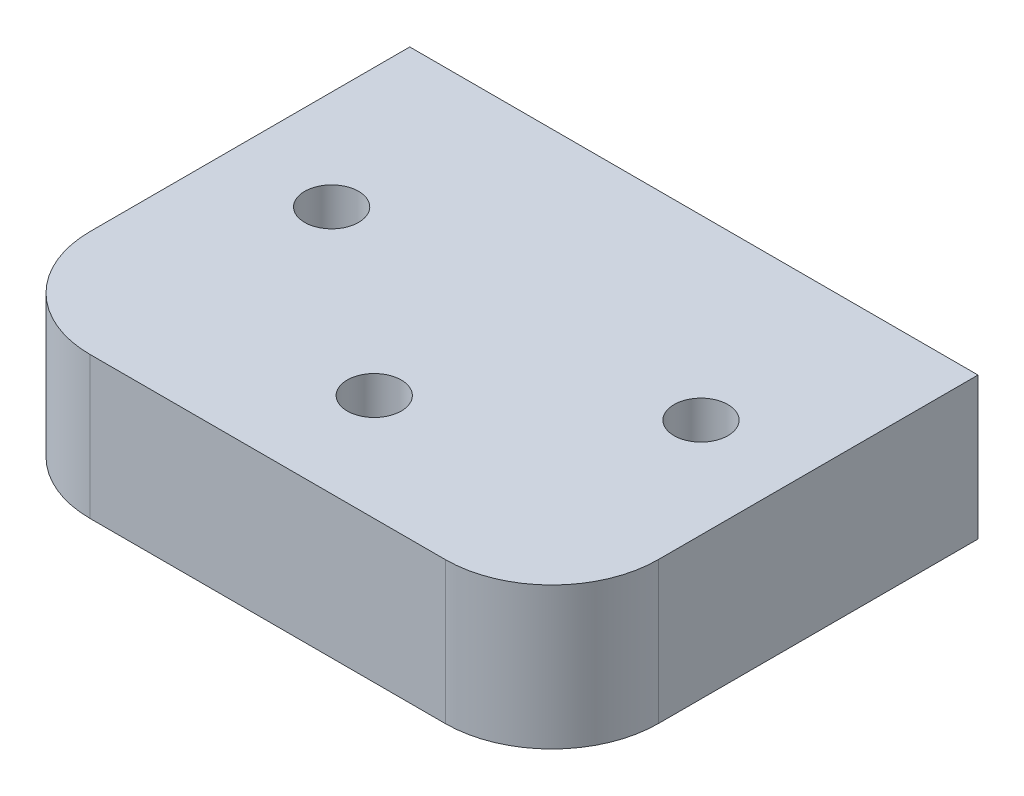
ISO-10303-21;
HEADER;
FILE_DESCRIPTION(('STEP AP214'),'2;1');
FILE_NAME('part.step','',(''),(''),'','','');
FILE_SCHEMA(('AUTOMOTIVE_DESIGN { 1 0 10303 214 1 1 1 1 }'));
ENDSEC;
DATA;
#1=APPLICATION_CONTEXT('core data for automotive mechanical design processes');
#2=APPLICATION_PROTOCOL_DEFINITION('international standard','automotive_design',2000,#1);
#3=PRODUCT_CONTEXT('',#1,'mechanical');
#4=PRODUCT('Part','Part','',(#3));
#5=PRODUCT_RELATED_PRODUCT_CATEGORY('part','',(#4));
#6=PRODUCT_DEFINITION_FORMATION('','',#4);
#7=PRODUCT_DEFINITION_CONTEXT('part definition',#1,'design');
#8=PRODUCT_DEFINITION('design','',#6,#7);
#9=PRODUCT_DEFINITION_SHAPE('','',#8);
#10=(LENGTH_UNIT() NAMED_UNIT(*) SI_UNIT(.MILLI.,.METRE.));
#11=(NAMED_UNIT(*) PLANE_ANGLE_UNIT() SI_UNIT($,.RADIAN.));
#12=(NAMED_UNIT(*) SI_UNIT($,.STERADIAN.) SOLID_ANGLE_UNIT());
#13=UNCERTAINTY_MEASURE_WITH_UNIT(LENGTH_MEASURE(1.E-05),#10,'distance_accuracy_value','');
#14=(GEOMETRIC_REPRESENTATION_CONTEXT(3) GLOBAL_UNCERTAINTY_ASSIGNED_CONTEXT((#13)) GLOBAL_UNIT_ASSIGNED_CONTEXT((#10,
#11,#12)) REPRESENTATION_CONTEXT('',''));
#15=CARTESIAN_POINT('',(0.,0.,0.));
#16=DIRECTION('',(0.,0.,1.));
#17=DIRECTION('',(1.,0.,0.));
#18=AXIS2_PLACEMENT_3D('',#15,#16,#17);
#19=CARTESIAN_POINT('',(0.,10.,0.));
#20=DIRECTION('',(1.,0.,0.));
#21=DIRECTION('',(0.,0.,-1.));
#22=AXIS2_PLACEMENT_3D('',#19,#20,#21);
#23=PLANE('',#22);
#24=DIRECTION('',(0.,0.,1.));
#25=VECTOR('',#24,1.);
#26=CARTESIAN_POINT('',(0.,0.,0.));
#27=LINE('',#26,#25);
#28=CARTESIAN_POINT('',(0.,0.,0.));
#29=VERTEX_POINT('',#28);
#30=CARTESIAN_POINT('',(0.,0.,22.5));
#31=VERTEX_POINT('',#30);
#32=EDGE_CURVE('E131',#29,#31,#27,.T.);
#33=ORIENTED_EDGE('',*,*,#32,.T.);
#34=DIRECTION('',(0.,-1.,0.));
#35=VECTOR('',#34,1.);
#36=CARTESIAN_POINT('',(0.,10.,22.5));
#37=LINE('',#36,#35);
#38=CARTESIAN_POINT('',(0.,10.,22.5));
#39=VERTEX_POINT('',#38);
#40=EDGE_CURVE('E11',#39,#31,#37,.T.);
#41=ORIENTED_EDGE('',*,*,#40,.F.);
#42=DIRECTION('',(0.,0.,1.));
#43=VECTOR('',#42,1.);
#44=CARTESIAN_POINT('',(0.,10.,0.));
#45=LINE('',#44,#43);
#46=CARTESIAN_POINT('',(0.,10.,0.));
#47=VERTEX_POINT('',#46);
#48=EDGE_CURVE('E148',#47,#39,#45,.T.);
#49=ORIENTED_EDGE('',*,*,#48,.F.);
#50=DIRECTION('',(0.,-1.,0.));
#51=VECTOR('',#50,1.);
#52=CARTESIAN_POINT('',(0.,10.,0.));
#53=LINE('',#52,#51);
#54=EDGE_CURVE('E127',#47,#29,#53,.T.);
#55=ORIENTED_EDGE('',*,*,#54,.T.);
#56=EDGE_LOOP('',(#33,#41,#49,#55));
#57=FACE_BOUND('',#56,.T.);
#58=ADVANCED_FACE('F39',(#57),#23,.F.);
#59=CARTESIAN_POINT('',(7.5,10.,22.5));
#60=DIRECTION('',(0.,-1.,0.));
#61=DIRECTION('',(0.,0.,-1.));
#62=AXIS2_PLACEMENT_3D('',#59,#60,#61);
#63=CYLINDRICAL_SURFACE('',#62,7.5);
#64=CARTESIAN_POINT('',(7.5,0.,22.5));
#65=DIRECTION('',(0.,1.,0.));
#66=DIRECTION('',(0.,0.,1.));
#67=AXIS2_PLACEMENT_3D('',#64,#65,#66);
#68=CIRCLE('',#67,7.5);
#69=CARTESIAN_POINT('',(7.5,0.,30.));
#70=VERTEX_POINT('',#69);
#71=EDGE_CURVE('E135',#31,#70,#68,.T.);
#72=ORIENTED_EDGE('',*,*,#71,.T.);
#73=DIRECTION('',(0.,-1.,0.));
#74=VECTOR('',#73,1.);
#75=CARTESIAN_POINT('',(7.5,10.,30.));
#76=LINE('',#75,#74);
#77=CARTESIAN_POINT('',(7.5,10.,30.));
#78=VERTEX_POINT('',#77);
#79=EDGE_CURVE('E48',#78,#70,#76,.T.);
#80=ORIENTED_EDGE('',*,*,#79,.F.);
#81=CARTESIAN_POINT('',(7.5,10.,22.5));
#82=DIRECTION('',(0.,1.,0.));
#83=DIRECTION('',(0.,0.,1.));
#84=AXIS2_PLACEMENT_3D('',#81,#82,#83);
#85=CIRCLE('',#84,7.5);
#86=EDGE_CURVE('E94',#39,#78,#85,.T.);
#87=ORIENTED_EDGE('',*,*,#86,.F.);
#88=ORIENTED_EDGE('',*,*,#40,.T.);
#89=EDGE_LOOP('',(#72,#80,#87,#88));
#90=FACE_BOUND('',#89,.T.);
#91=ADVANCED_FACE('F180',(#90),#63,.T.);
#92=CARTESIAN_POINT('',(7.5,10.,30.));
#93=DIRECTION('',(0.,0.,-1.));
#94=DIRECTION('',(-1.,0.,0.));
#95=AXIS2_PLACEMENT_3D('',#92,#93,#94);
#96=PLANE('',#95);
#97=DIRECTION('',(1.,0.,0.));
#98=VECTOR('',#97,1.);
#99=CARTESIAN_POINT('',(7.5,0.,30.));
#100=LINE('',#99,#98);
#101=CARTESIAN_POINT('',(32.5,0.,30.));
#102=VERTEX_POINT('',#101);
#103=EDGE_CURVE('E139',#70,#102,#100,.T.);
#104=ORIENTED_EDGE('',*,*,#103,.T.);
#105=DIRECTION('',(0.,-1.,0.));
#106=VECTOR('',#105,1.);
#107=CARTESIAN_POINT('',(32.5,10.,30.));
#108=LINE('',#107,#106);
#109=CARTESIAN_POINT('',(32.5,10.,30.));
#110=VERTEX_POINT('',#109);
#111=EDGE_CURVE('E120',#110,#102,#108,.T.);
#112=ORIENTED_EDGE('',*,*,#111,.F.);
#113=DIRECTION('',(1.,0.,0.));
#114=VECTOR('',#113,1.);
#115=CARTESIAN_POINT('',(7.5,10.,30.));
#116=LINE('',#115,#114);
#117=EDGE_CURVE('E109',#78,#110,#116,.T.);
#118=ORIENTED_EDGE('',*,*,#117,.F.);
#119=ORIENTED_EDGE('',*,*,#79,.T.);
#120=EDGE_LOOP('',(#104,#112,#118,#119));
#121=FACE_BOUND('',#120,.T.);
#122=ADVANCED_FACE('F158',(#121),#96,.F.);
#123=CARTESIAN_POINT('',(32.5,10.,22.5));
#124=DIRECTION('',(0.,-1.,0.));
#125=DIRECTION('',(0.,0.,-1.));
#126=AXIS2_PLACEMENT_3D('',#123,#124,#125);
#127=CYLINDRICAL_SURFACE('',#126,7.5);
#128=CARTESIAN_POINT('',(32.5,0.,22.5));
#129=DIRECTION('',(0.,1.,0.));
#130=DIRECTION('',(0.,0.,1.));
#131=AXIS2_PLACEMENT_3D('',#128,#129,#130);
#132=CIRCLE('',#131,7.5);
#133=CARTESIAN_POINT('',(40.,0.,22.5));
#134=VERTEX_POINT('',#133);
#135=EDGE_CURVE('E118',#102,#134,#132,.T.);
#136=ORIENTED_EDGE('',*,*,#135,.T.);
#137=DIRECTION('',(0.,-1.,0.));
#138=VECTOR('',#137,1.);
#139=CARTESIAN_POINT('',(40.,10.,22.5));
#140=LINE('',#139,#138);
#141=CARTESIAN_POINT('',(40.,10.,22.5));
#142=VERTEX_POINT('',#141);
#143=EDGE_CURVE('E115',#142,#134,#140,.T.);
#144=ORIENTED_EDGE('',*,*,#143,.F.);
#145=CARTESIAN_POINT('',(32.5,10.,22.5));
#146=DIRECTION('',(0.,1.,0.));
#147=DIRECTION('',(0.,0.,1.));
#148=AXIS2_PLACEMENT_3D('',#145,#146,#147);
#149=CIRCLE('',#148,7.5);
#150=EDGE_CURVE('E103',#110,#142,#149,.T.);
#151=ORIENTED_EDGE('',*,*,#150,.F.);
#152=ORIENTED_EDGE('',*,*,#111,.T.);
#153=EDGE_LOOP('',(#136,#144,#151,#152));
#154=FACE_BOUND('',#153,.T.);
#155=ADVANCED_FACE('F116',(#154),#127,.T.);
#156=CARTESIAN_POINT('',(40.,10.,0.));
#157=DIRECTION('',(-1.,0.,0.));
#158=DIRECTION('',(0.,0.,1.));
#159=AXIS2_PLACEMENT_3D('',#156,#157,#158);
#160=PLANE('',#159);
#161=DIRECTION('',(0.,0.,-1.));
#162=VECTOR('',#161,1.);
#163=CARTESIAN_POINT('',(40.,0.,0.));
#164=LINE('',#163,#162);
#165=CARTESIAN_POINT('',(40.,0.,0.));
#166=VERTEX_POINT('',#165);
#167=EDGE_CURVE('E80',#134,#166,#164,.T.);
#168=ORIENTED_EDGE('',*,*,#167,.T.);
#169=DIRECTION('',(0.,-1.,0.));
#170=VECTOR('',#169,1.);
#171=CARTESIAN_POINT('',(40.,10.,0.));
#172=LINE('',#171,#170);
#173=CARTESIAN_POINT('',(40.,10.,0.));
#174=VERTEX_POINT('',#173);
#175=EDGE_CURVE('E121',#174,#166,#172,.T.);
#176=ORIENTED_EDGE('',*,*,#175,.F.);
#177=DIRECTION('',(0.,0.,-1.));
#178=VECTOR('',#177,1.);
#179=CARTESIAN_POINT('',(40.,10.,0.));
#180=LINE('',#179,#178);
#181=EDGE_CURVE('E107',#142,#174,#180,.T.);
#182=ORIENTED_EDGE('',*,*,#181,.F.);
#183=ORIENTED_EDGE('',*,*,#143,.T.);
#184=EDGE_LOOP('',(#168,#176,#182,#183));
#185=FACE_BOUND('',#184,.T.);
#186=ADVANCED_FACE('F123',(#185),#160,.F.);
#187=CARTESIAN_POINT('',(0.,10.,0.));
#188=DIRECTION('',(0.,0.,1.));
#189=DIRECTION('',(1.,0.,0.));
#190=AXIS2_PLACEMENT_3D('',#187,#188,#189);
#191=PLANE('',#190);
#192=CARTESIAN_POINT('',(32.5,5.,0.));
#193=DIRECTION('',(0.,0.,-1.));
#194=DIRECTION('',(-1.,0.,0.));
#195=AXIS2_PLACEMENT_3D('',#192,#193,#194);
#196=CIRCLE('',#195,1.35255);
#197=CARTESIAN_POINT('',(31.14745,5.,0.));
#198=VERTEX_POINT('',#197);
#199=EDGE_CURVE('E315',#198,#198,#196,.T.);
#200=ORIENTED_EDGE('',*,*,#199,.F.);
#201=EDGE_LOOP('',(#200));
#202=FACE_BOUND('',#201,.T.);
#203=CARTESIAN_POINT('',(20.,5.,0.));
#204=DIRECTION('',(0.,0.,-1.));
#205=DIRECTION('',(-1.,0.,0.));
#206=AXIS2_PLACEMENT_3D('',#203,#204,#205);
#207=CIRCLE('',#206,1.35255);
#208=CARTESIAN_POINT('',(18.64745,5.,0.));
#209=VERTEX_POINT('',#208);
#210=EDGE_CURVE('E319',#209,#209,#207,.T.);
#211=ORIENTED_EDGE('',*,*,#210,.F.);
#212=EDGE_LOOP('',(#211));
#213=FACE_BOUND('',#212,.T.);
#214=CARTESIAN_POINT('',(7.5,5.,0.));
#215=DIRECTION('',(0.,0.,-1.));
#216=DIRECTION('',(-1.,0.,0.));
#217=AXIS2_PLACEMENT_3D('',#214,#215,#216);
#218=CIRCLE('',#217,1.35255);
#219=CARTESIAN_POINT('',(6.14745,5.,0.));
#220=VERTEX_POINT('',#219);
#221=EDGE_CURVE('E329',#220,#220,#218,.T.);
#222=ORIENTED_EDGE('',*,*,#221,.F.);
#223=EDGE_LOOP('',(#222));
#224=FACE_BOUND('',#223,.T.);
#225=DIRECTION('',(-1.,0.,0.));
#226=VECTOR('',#225,1.);
#227=CARTESIAN_POINT('',(0.,0.,0.));
#228=LINE('',#227,#226);
#229=EDGE_CURVE('E86',#166,#29,#228,.T.);
#230=ORIENTED_EDGE('',*,*,#229,.T.);
#231=ORIENTED_EDGE('',*,*,#54,.F.);
#232=DIRECTION('',(-1.,0.,0.));
#233=VECTOR('',#232,1.);
#234=CARTESIAN_POINT('',(0.,10.,0.));
#235=LINE('',#234,#233);
#236=EDGE_CURVE('E56',#174,#47,#235,.T.);
#237=ORIENTED_EDGE('',*,*,#236,.F.);
#238=ORIENTED_EDGE('',*,*,#175,.T.);
#239=EDGE_LOOP('',(#230,#231,#237,#238));
#240=FACE_BOUND('',#239,.T.);
#241=ADVANCED_FACE('F165',(#202,#213,#224,#240),#191,.F.);
#242=CARTESIAN_POINT('',(7.5,10.,22.5));
#243=DIRECTION('',(0.,1.,0.));
#244=DIRECTION('',(0.,0.,1.));
#245=AXIS2_PLACEMENT_3D('',#242,#243,#244);
#246=PLANE('',#245);
#247=CARTESIAN_POINT('',(7.,10.,12.5));
#248=DIRECTION('',(0.,1.,0.));
#249=DIRECTION('',(0.,0.,1.));
#250=AXIS2_PLACEMENT_3D('',#247,#248,#249);
#251=CIRCLE('',#250,1.89865);
#252=CARTESIAN_POINT('',(7.,10.,14.39865));
#253=VERTEX_POINT('',#252);
#254=EDGE_CURVE('E337',#253,#253,#251,.T.);
#255=ORIENTED_EDGE('',*,*,#254,.F.);
#256=EDGE_LOOP('',(#255));
#257=FACE_BOUND('',#256,.T.);
#258=CARTESIAN_POINT('',(33.,10.,12.5));
#259=DIRECTION('',(0.,1.,0.));
#260=DIRECTION('',(0.,0.,1.));
#261=AXIS2_PLACEMENT_3D('',#258,#259,#260);
#262=CIRCLE('',#261,1.89865);
#263=CARTESIAN_POINT('',(33.,10.,14.39865));
#264=VERTEX_POINT('',#263);
#265=EDGE_CURVE('E345',#264,#264,#262,.T.);
#266=ORIENTED_EDGE('',*,*,#265,.F.);
#267=EDGE_LOOP('',(#266));
#268=FACE_BOUND('',#267,.T.);
#269=CARTESIAN_POINT('',(20.,10.,22.5));
#270=DIRECTION('',(0.,1.,0.));
#271=DIRECTION('',(0.,0.,1.));
#272=AXIS2_PLACEMENT_3D('',#269,#270,#271);
#273=CIRCLE('',#272,1.89865);
#274=CARTESIAN_POINT('',(20.,10.,24.39865));
#275=VERTEX_POINT('',#274);
#276=EDGE_CURVE('E353',#275,#275,#273,.T.);
#277=ORIENTED_EDGE('',*,*,#276,.F.);
#278=EDGE_LOOP('',(#277));
#279=FACE_BOUND('',#278,.T.);
#280=ORIENTED_EDGE('',*,*,#48,.T.);
#281=ORIENTED_EDGE('',*,*,#86,.T.);
#282=ORIENTED_EDGE('',*,*,#117,.T.);
#283=ORIENTED_EDGE('',*,*,#150,.T.);
#284=ORIENTED_EDGE('',*,*,#181,.T.);
#285=ORIENTED_EDGE('',*,*,#236,.T.);
#286=EDGE_LOOP('',(#280,#281,#282,#283,#284,#285));
#287=FACE_BOUND('',#286,.T.);
#288=ADVANCED_FACE('F105',(#257,#268,#279,#287),#246,.T.);
#289=CARTESIAN_POINT('',(7.5,0.,22.5));
#290=DIRECTION('',(0.,1.,0.));
#291=DIRECTION('',(0.,0.,1.));
#292=AXIS2_PLACEMENT_3D('',#289,#290,#291);
#293=PLANE('',#292);
#294=CARTESIAN_POINT('',(7.,0.,12.5));
#295=DIRECTION('',(0.,1.,0.));
#296=DIRECTION('',(0.,0.,1.));
#297=AXIS2_PLACEMENT_3D('',#294,#295,#296);
#298=CIRCLE('',#297,1.89865);
#299=CARTESIAN_POINT('',(7.,0.,14.39865));
#300=VERTEX_POINT('',#299);
#301=EDGE_CURVE('E341',#300,#300,#298,.T.);
#302=ORIENTED_EDGE('',*,*,#301,.T.);
#303=EDGE_LOOP('',(#302));
#304=FACE_BOUND('',#303,.T.);
#305=CARTESIAN_POINT('',(33.,0.,12.5));
#306=DIRECTION('',(0.,1.,0.));
#307=DIRECTION('',(0.,0.,1.));
#308=AXIS2_PLACEMENT_3D('',#305,#306,#307);
#309=CIRCLE('',#308,1.89864999999999);
#310=CARTESIAN_POINT('',(33.,0.,14.39865));
#311=VERTEX_POINT('',#310);
#312=EDGE_CURVE('E349',#311,#311,#309,.T.);
#313=ORIENTED_EDGE('',*,*,#312,.T.);
#314=EDGE_LOOP('',(#313));
#315=FACE_BOUND('',#314,.T.);
#316=CARTESIAN_POINT('',(20.,0.,22.5));
#317=DIRECTION('',(0.,1.,0.));
#318=DIRECTION('',(0.,0.,1.));
#319=AXIS2_PLACEMENT_3D('',#316,#317,#318);
#320=CIRCLE('',#319,1.89865);
#321=CARTESIAN_POINT('',(20.,0.,24.39865));
#322=VERTEX_POINT('',#321);
#323=EDGE_CURVE('E136',#322,#322,#320,.T.);
#324=ORIENTED_EDGE('',*,*,#323,.T.);
#325=EDGE_LOOP('',(#324));
#326=FACE_BOUND('',#325,.T.);
#327=ORIENTED_EDGE('',*,*,#32,.F.);
#328=ORIENTED_EDGE('',*,*,#229,.F.);
#329=ORIENTED_EDGE('',*,*,#167,.F.);
#330=ORIENTED_EDGE('',*,*,#135,.F.);
#331=ORIENTED_EDGE('',*,*,#103,.F.);
#332=ORIENTED_EDGE('',*,*,#71,.F.);
#333=EDGE_LOOP('',(#327,#328,#329,#330,#331,#332));
#334=FACE_BOUND('',#333,.T.);
#335=ADVANCED_FACE('F161',(#304,#315,#326,#334),#293,.F.);
#336=CARTESIAN_POINT('',(20.,10.,22.5));
#337=DIRECTION('',(0.,1.,0.));
#338=DIRECTION('',(0.,0.,1.));
#339=AXIS2_PLACEMENT_3D('',#336,#337,#338);
#340=CYLINDRICAL_SURFACE('',#339,1.89865);
#341=ORIENTED_EDGE('',*,*,#323,.F.);
#342=EDGE_LOOP('',(#341));
#343=FACE_BOUND('',#342,.T.);
#344=ORIENTED_EDGE('',*,*,#276,.T.);
#345=EDGE_LOOP('',(#344));
#346=FACE_BOUND('',#345,.T.);
#347=ADVANCED_FACE('F214',(#343,#346),#340,.F.);
#348=CARTESIAN_POINT('',(33.,10.,12.5));
#349=DIRECTION('',(0.,1.,0.));
#350=DIRECTION('',(0.,0.,1.));
#351=AXIS2_PLACEMENT_3D('',#348,#349,#350);
#352=CYLINDRICAL_SURFACE('',#351,1.89865);
#353=ORIENTED_EDGE('',*,*,#312,.F.);
#354=EDGE_LOOP('',(#353));
#355=FACE_BOUND('',#354,.T.);
#356=ORIENTED_EDGE('',*,*,#265,.T.);
#357=EDGE_LOOP('',(#356));
#358=FACE_BOUND('',#357,.T.);
#359=ADVANCED_FACE('F223',(#355,#358),#352,.F.);
#360=CARTESIAN_POINT('',(7.,10.,12.5));
#361=DIRECTION('',(0.,1.,0.));
#362=DIRECTION('',(0.,0.,1.));
#363=AXIS2_PLACEMENT_3D('',#360,#361,#362);
#364=CYLINDRICAL_SURFACE('',#363,1.89865);
#365=ORIENTED_EDGE('',*,*,#301,.F.);
#366=EDGE_LOOP('',(#365));
#367=FACE_BOUND('',#366,.T.);
#368=ORIENTED_EDGE('',*,*,#254,.T.);
#369=EDGE_LOOP('',(#368));
#370=FACE_BOUND('',#369,.T.);
#371=ADVANCED_FACE('F233',(#367,#370),#364,.F.);
#372=CARTESIAN_POINT('',(7.5,5.,9.53));
#373=DIRECTION('',(0.,0.,-1.));
#374=DIRECTION('',(-1.,0.,0.));
#375=AXIS2_PLACEMENT_3D('',#372,#373,#374);
#376=CONICAL_SURFACE('',#375,1.35255,1.02974425867665);
#377=CARTESIAN_POINT('',(7.49999999999999,5.,10.3426940302657));
#378=VERTEX_POINT('',#377);
#379=VERTEX_LOOP('',#378);
#380=FACE_BOUND('',#379,.T.);
#381=CARTESIAN_POINT('',(7.5,5.,9.53));
#382=DIRECTION('',(0.,0.,-1.));
#383=DIRECTION('',(-1.,0.,0.));
#384=AXIS2_PLACEMENT_3D('',#381,#382,#383);
#385=CIRCLE('',#384,1.35255);
#386=CARTESIAN_POINT('',(6.14745,5.,9.53));
#387=VERTEX_POINT('',#386);
#388=EDGE_CURVE('E333',#387,#387,#385,.T.);
#389=ORIENTED_EDGE('',*,*,#388,.T.);
#390=EDGE_LOOP('',(#389));
#391=FACE_BOUND('',#390,.T.);
#392=ADVANCED_FACE('F242',(#380,#391),#376,.F.);
#393=CARTESIAN_POINT('',(7.5,5.,0.));
#394=DIRECTION('',(0.,0.,-1.));
#395=DIRECTION('',(-1.,0.,0.));
#396=AXIS2_PLACEMENT_3D('',#393,#394,#395);
#397=CYLINDRICAL_SURFACE('',#396,1.35255);
#398=ORIENTED_EDGE('',*,*,#388,.F.);
#399=EDGE_LOOP('',(#398));
#400=FACE_BOUND('',#399,.T.);
#401=ORIENTED_EDGE('',*,*,#221,.T.);
#402=EDGE_LOOP('',(#401));
#403=FACE_BOUND('',#402,.T.);
#404=ADVANCED_FACE('F256',(#400,#403),#397,.F.);
#405=CARTESIAN_POINT('',(20.,5.,9.53));
#406=DIRECTION('',(0.,0.,-1.));
#407=DIRECTION('',(-1.,0.,0.));
#408=AXIS2_PLACEMENT_3D('',#405,#406,#407);
#409=CONICAL_SURFACE('',#408,1.35255,1.02974425867665);
#410=CARTESIAN_POINT('',(20.,5.,10.3426940302657));
#411=VERTEX_POINT('',#410);
#412=VERTEX_LOOP('',#411);
#413=FACE_BOUND('',#412,.T.);
#414=CARTESIAN_POINT('',(20.,5.,9.53));
#415=DIRECTION('',(0.,0.,-1.));
#416=DIRECTION('',(-1.,0.,0.));
#417=AXIS2_PLACEMENT_3D('',#414,#415,#416);
#418=CIRCLE('',#417,1.35255);
#419=CARTESIAN_POINT('',(18.64745,5.,9.53));
#420=VERTEX_POINT('',#419);
#421=EDGE_CURVE('E325',#420,#420,#418,.T.);
#422=ORIENTED_EDGE('',*,*,#421,.T.);
#423=EDGE_LOOP('',(#422));
#424=FACE_BOUND('',#423,.T.);
#425=ADVANCED_FACE('F266',(#413,#424),#409,.F.);
#426=CARTESIAN_POINT('',(20.,5.,0.));
#427=DIRECTION('',(0.,0.,-1.));
#428=DIRECTION('',(-1.,0.,0.));
#429=AXIS2_PLACEMENT_3D('',#426,#427,#428);
#430=CYLINDRICAL_SURFACE('',#429,1.35255);
#431=ORIENTED_EDGE('',*,*,#421,.F.);
#432=EDGE_LOOP('',(#431));
#433=FACE_BOUND('',#432,.T.);
#434=ORIENTED_EDGE('',*,*,#210,.T.);
#435=EDGE_LOOP('',(#434));
#436=FACE_BOUND('',#435,.T.);
#437=ADVANCED_FACE('F276',(#433,#436),#430,.F.);
#438=CARTESIAN_POINT('',(32.5,5.,9.53));
#439=DIRECTION('',(0.,0.,-1.));
#440=DIRECTION('',(-1.,0.,0.));
#441=AXIS2_PLACEMENT_3D('',#438,#439,#440);
#442=CONICAL_SURFACE('',#441,1.35254999999999,1.02974425867665);
#443=CARTESIAN_POINT('',(32.5,5.,10.3426940302657));
#444=VERTEX_POINT('',#443);
#445=VERTEX_LOOP('',#444);
#446=FACE_BOUND('',#445,.T.);
#447=CARTESIAN_POINT('',(32.5,5.,9.53));
#448=DIRECTION('',(0.,0.,-1.));
#449=DIRECTION('',(-1.,0.,0.));
#450=AXIS2_PLACEMENT_3D('',#447,#448,#449);
#451=CIRCLE('',#450,1.35254999999999);
#452=CARTESIAN_POINT('',(31.14745,5.,9.53));
#453=VERTEX_POINT('',#452);
#454=EDGE_CURVE('E313',#453,#453,#451,.T.);
#455=ORIENTED_EDGE('',*,*,#454,.T.);
#456=EDGE_LOOP('',(#455));
#457=FACE_BOUND('',#456,.T.);
#458=ADVANCED_FACE('F286',(#446,#457),#442,.F.);
#459=CARTESIAN_POINT('',(32.5,5.,0.));
#460=DIRECTION('',(0.,0.,-1.));
#461=DIRECTION('',(-1.,0.,0.));
#462=AXIS2_PLACEMENT_3D('',#459,#460,#461);
#463=CYLINDRICAL_SURFACE('',#462,1.35255);
#464=ORIENTED_EDGE('',*,*,#454,.F.);
#465=EDGE_LOOP('',(#464));
#466=FACE_BOUND('',#465,.T.);
#467=ORIENTED_EDGE('',*,*,#199,.T.);
#468=EDGE_LOOP('',(#467));
#469=FACE_BOUND('',#468,.T.);
#470=ADVANCED_FACE('F296',(#466,#469),#463,.F.);
#471=CLOSED_SHELL('',(#58,#91,#122,#155,#186,#241,#288,#335,#347,#359,#371,#392,#404,#425,#437,
#458,#470));
#472=MANIFOLD_SOLID_BREP('B2',#471);
#473=ADVANCED_BREP_SHAPE_REPRESENTATION('',(#18,#472),#14);
#474=SHAPE_DEFINITION_REPRESENTATION(#9,#473);
ENDSEC;
END-ISO-10303-21;
